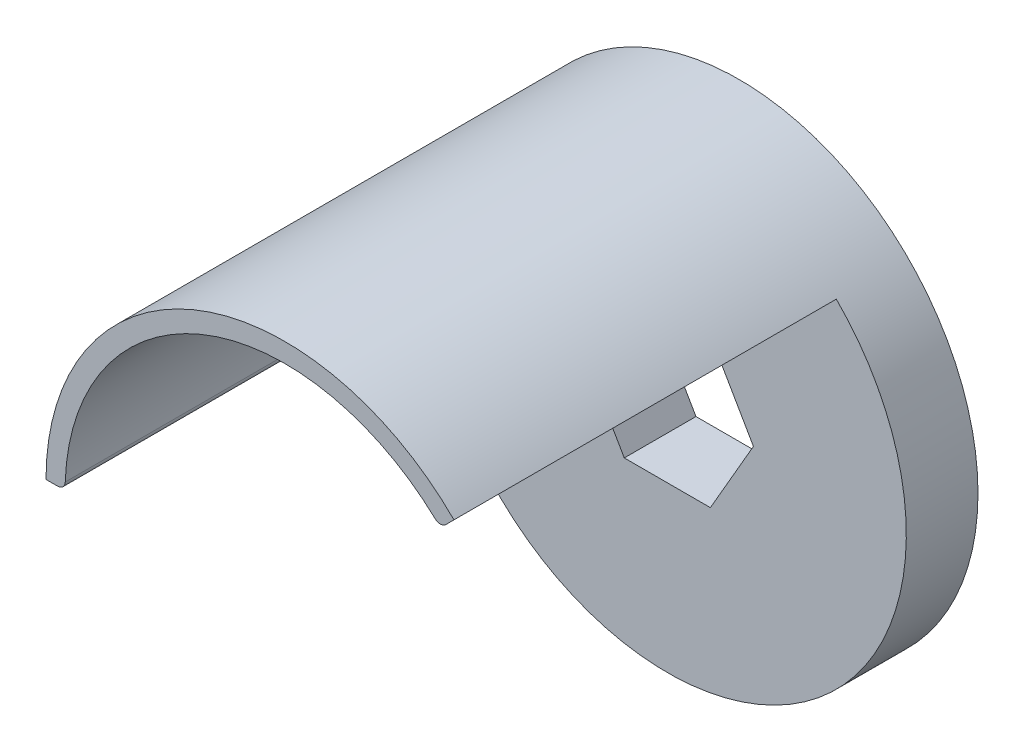
ISO-10303-21;
HEADER;
FILE_DESCRIPTION(('STEP AP214'),'2;1');
FILE_NAME('part.step','',(''),(''),'','','');
FILE_SCHEMA(('AUTOMOTIVE_DESIGN { 1 0 10303 214 1 1 1 1 }'));
ENDSEC;
DATA;
#1=APPLICATION_CONTEXT('core data for automotive mechanical design processes');
#2=APPLICATION_PROTOCOL_DEFINITION('international standard','automotive_design',2000,#1);
#3=PRODUCT_CONTEXT('',#1,'mechanical');
#4=PRODUCT('Part','Part','',(#3));
#5=PRODUCT_RELATED_PRODUCT_CATEGORY('part','',(#4));
#6=PRODUCT_DEFINITION_FORMATION('','',#4);
#7=PRODUCT_DEFINITION_CONTEXT('part definition',#1,'design');
#8=PRODUCT_DEFINITION('design','',#6,#7);
#9=PRODUCT_DEFINITION_SHAPE('','',#8);
#10=(LENGTH_UNIT() NAMED_UNIT(*) SI_UNIT(.MILLI.,.METRE.));
#11=(NAMED_UNIT(*) PLANE_ANGLE_UNIT() SI_UNIT($,.RADIAN.));
#12=(NAMED_UNIT(*) SI_UNIT($,.STERADIAN.) SOLID_ANGLE_UNIT());
#13=UNCERTAINTY_MEASURE_WITH_UNIT(LENGTH_MEASURE(1.E-05),#10,'distance_accuracy_value','');
#14=(GEOMETRIC_REPRESENTATION_CONTEXT(3) GLOBAL_UNCERTAINTY_ASSIGNED_CONTEXT((#13)) GLOBAL_UNIT_ASSIGNED_CONTEXT((#10,
#11,#12)) REPRESENTATION_CONTEXT('',''));
#15=CARTESIAN_POINT('',(0.,0.,0.));
#16=DIRECTION('',(0.,0.,1.));
#17=DIRECTION('',(1.,0.,0.));
#18=AXIS2_PLACEMENT_3D('',#15,#16,#17);
#19=CARTESIAN_POINT('',(0.,0.,4.7625));
#20=DIRECTION('',(0.,0.,1.));
#21=DIRECTION('',(1.,0.,0.));
#22=AXIS2_PLACEMENT_3D('',#19,#20,#21);
#23=PLANE('',#22);
#24=DIRECTION('',(-0.5,0.866025403784438,0.));
#25=VECTOR('',#24,1.);
#26=CARTESIAN_POINT('',(5.71923176659244,0.,4.7625));
#27=LINE('',#26,#25);
#28=CARTESIAN_POINT('',(5.71923176659244,0.,4.7625));
#29=VERTEX_POINT('',#28);
#30=CARTESIAN_POINT('',(2.85961588329621,4.953,4.7625));
#31=VERTEX_POINT('',#30);
#32=EDGE_CURVE('E182',#29,#31,#27,.T.);
#33=ORIENTED_EDGE('',*,*,#32,.F.);
#34=DIRECTION('',(0.5,0.866025403784439,0.));
#35=VECTOR('',#34,1.);
#36=CARTESIAN_POINT('',(2.85961588329622,-4.953,4.7625));
#37=LINE('',#36,#35);
#38=CARTESIAN_POINT('',(2.85961588329622,-4.953,4.7625));
#39=VERTEX_POINT('',#38);
#40=EDGE_CURVE('E179',#39,#29,#37,.T.);
#41=ORIENTED_EDGE('',*,*,#40,.F.);
#42=DIRECTION('',(1.,0.,0.));
#43=VECTOR('',#42,1.);
#44=CARTESIAN_POINT('',(-2.85961588329621,-4.953,4.7625));
#45=LINE('',#44,#43);
#46=CARTESIAN_POINT('',(-2.85961588329621,-4.953,4.7625));
#47=VERTEX_POINT('',#46);
#48=EDGE_CURVE('E196',#47,#39,#45,.T.);
#49=ORIENTED_EDGE('',*,*,#48,.F.);
#50=DIRECTION('',(0.5,-0.866025403784439,0.));
#51=VECTOR('',#50,1.);
#52=CARTESIAN_POINT('',(-5.71923176659243,0.,4.7625));
#53=LINE('',#52,#51);
#54=CARTESIAN_POINT('',(-5.71923176659243,0.,4.7625));
#55=VERTEX_POINT('',#54);
#56=EDGE_CURVE('E192',#55,#47,#53,.T.);
#57=ORIENTED_EDGE('',*,*,#56,.F.);
#58=DIRECTION('',(-0.5,-0.866025403784439,0.));
#59=VECTOR('',#58,1.);
#60=CARTESIAN_POINT('',(-2.85961588329622,4.953,4.7625));
#61=LINE('',#60,#59);
#62=CARTESIAN_POINT('',(-2.85961588329622,4.953,4.7625));
#63=VERTEX_POINT('',#62);
#64=EDGE_CURVE('E189',#63,#55,#61,.T.);
#65=ORIENTED_EDGE('',*,*,#64,.F.);
#66=DIRECTION('',(-1.,0.,0.));
#67=VECTOR('',#66,1.);
#68=CARTESIAN_POINT('',(2.85961588329621,4.953,4.7625));
#69=LINE('',#68,#67);
#70=EDGE_CURVE('E186',#31,#63,#69,.T.);
#71=ORIENTED_EDGE('',*,*,#70,.F.);
#72=EDGE_LOOP('',(#33,#41,#49,#57,#65,#71));
#73=FACE_BOUND('',#72,.T.);
#74=DIRECTION('',(0.707106781186551,0.707106781186544,0.));
#75=VECTOR('',#74,1.);
#76=CARTESIAN_POINT('',(0.,0.,4.7625));
#77=LINE('',#76,#75);
#78=CARTESIAN_POINT('',(10.6804659308478,10.6804659308477,4.7625));
#79=VERTEX_POINT('',#78);
#80=CARTESIAN_POINT('',(11.2253201513365,11.2253201513364,4.7625));
#81=VERTEX_POINT('',#80);
#82=EDGE_CURVE('E151',#79,#81,#77,.T.);
#83=ORIENTED_EDGE('',*,*,#82,.F.);
#84=CARTESIAN_POINT('',(10.3212556860051,11.0396761756905,4.7625));
#85=DIRECTION('',(0.,0.,1.));
#86=DIRECTION('',(1.,0.,0.));
#87=AXIS2_PLACEMENT_3D('',#84,#85,#86);
#88=CIRCLE('',#87,0.508);
#89=CARTESIAN_POINT('',(9.9743227217696,10.6685946235664,4.7625));
#90=VERTEX_POINT('',#89);
#91=EDGE_CURVE('E53',#79,#90,#88,.F.);
#92=ORIENTED_EDGE('',*,*,#91,.T.);
#93=CARTESIAN_POINT('',(0.,0.,4.7625));
#94=DIRECTION('',(0.,0.,1.));
#95=DIRECTION('',(1.,0.,0.));
#96=AXIS2_PLACEMENT_3D('',#93,#94,#95);
#97=CIRCLE('',#96,14.605);
#98=CARTESIAN_POINT('',(-14.5967468383605,0.490924369747899,4.7625));
#99=VERTEX_POINT('',#98);
#100=EDGE_CURVE('E169',#90,#99,#97,.T.);
#101=ORIENTED_EDGE('',*,*,#100,.T.);
#102=CARTESIAN_POINT('',(-15.1044597718687,0.508,4.7625));
#103=DIRECTION('',(0.,0.,1.));
#104=DIRECTION('',(1.,0.,0.));
#105=AXIS2_PLACEMENT_3D('',#102,#103,#104);
#106=CIRCLE('',#105,0.508);
#107=CARTESIAN_POINT('',(-15.1044597718687,0.,4.7625));
#108=VERTEX_POINT('',#107);
#109=EDGE_CURVE('E11',#99,#108,#106,.F.);
#110=ORIENTED_EDGE('',*,*,#109,.T.);
#111=DIRECTION('',(-1.,0.,0.));
#112=VECTOR('',#111,1.);
#113=CARTESIAN_POINT('',(0.,0.,4.7625));
#114=LINE('',#113,#112);
#115=CARTESIAN_POINT('',(-15.875,0.,4.7625));
#116=VERTEX_POINT('',#115);
#117=EDGE_CURVE('E174',#108,#116,#114,.T.);
#118=ORIENTED_EDGE('',*,*,#117,.T.);
#119=CARTESIAN_POINT('',(0.,0.,4.7625));
#120=DIRECTION('',(0.,0.,1.));
#121=DIRECTION('',(1.,0.,0.));
#122=AXIS2_PLACEMENT_3D('',#119,#120,#121);
#123=CIRCLE('',#122,15.875);
#124=EDGE_CURVE('E242',#116,#81,#123,.T.);
#125=ORIENTED_EDGE('',*,*,#124,.T.);
#126=EDGE_LOOP('',(#83,#92,#101,#110,#118,#125));
#127=FACE_BOUND('',#126,.T.);
#128=ADVANCED_FACE('F44',(#73,#127),#23,.T.);
#129=CARTESIAN_POINT('',(0.,0.,0.));
#130=DIRECTION('',(0.,0.,1.));
#131=DIRECTION('',(1.,0.,0.));
#132=AXIS2_PLACEMENT_3D('',#129,#130,#131);
#133=PLANE('',#132);
#134=CARTESIAN_POINT('',(0.,0.,0.));
#135=DIRECTION('',(0.,0.,1.));
#136=DIRECTION('',(1.,0.,0.));
#137=AXIS2_PLACEMENT_3D('',#134,#135,#136);
#138=CIRCLE('',#137,15.875);
#139=CARTESIAN_POINT('',(15.875,0.,0.));
#140=VERTEX_POINT('',#139);
#141=EDGE_CURVE('E241',#140,#140,#138,.T.);
#142=ORIENTED_EDGE('',*,*,#141,.F.);
#143=EDGE_LOOP('',(#142));
#144=FACE_BOUND('',#143,.T.);
#145=DIRECTION('',(0.5,0.866025403784439,0.));
#146=VECTOR('',#145,1.);
#147=CARTESIAN_POINT('',(2.85961588329622,-4.953,0.));
#148=LINE('',#147,#146);
#149=CARTESIAN_POINT('',(2.85961588329622,-4.953,0.));
#150=VERTEX_POINT('',#149);
#151=CARTESIAN_POINT('',(5.71923176659244,0.,0.));
#152=VERTEX_POINT('',#151);
#153=EDGE_CURVE('E156',#150,#152,#148,.T.);
#154=ORIENTED_EDGE('',*,*,#153,.T.);
#155=DIRECTION('',(-0.5,0.866025403784438,0.));
#156=VECTOR('',#155,1.);
#157=CARTESIAN_POINT('',(5.71923176659244,0.,0.));
#158=LINE('',#157,#156);
#159=CARTESIAN_POINT('',(2.85961588329621,4.953,0.));
#160=VERTEX_POINT('',#159);
#161=EDGE_CURVE('E203',#152,#160,#158,.T.);
#162=ORIENTED_EDGE('',*,*,#161,.T.);
#163=DIRECTION('',(-1.,0.,0.));
#164=VECTOR('',#163,1.);
#165=CARTESIAN_POINT('',(2.85961588329621,4.953,0.));
#166=LINE('',#165,#164);
#167=CARTESIAN_POINT('',(-2.85961588329622,4.953,0.));
#168=VERTEX_POINT('',#167);
#169=EDGE_CURVE('E207',#160,#168,#166,.T.);
#170=ORIENTED_EDGE('',*,*,#169,.T.);
#171=DIRECTION('',(-0.5,-0.866025403784439,0.));
#172=VECTOR('',#171,1.);
#173=CARTESIAN_POINT('',(-2.85961588329622,4.953,0.));
#174=LINE('',#173,#172);
#175=CARTESIAN_POINT('',(-5.71923176659243,0.,0.));
#176=VERTEX_POINT('',#175);
#177=EDGE_CURVE('E211',#168,#176,#174,.T.);
#178=ORIENTED_EDGE('',*,*,#177,.T.);
#179=DIRECTION('',(0.5,-0.866025403784439,0.));
#180=VECTOR('',#179,1.);
#181=CARTESIAN_POINT('',(-5.71923176659243,0.,0.));
#182=LINE('',#181,#180);
#183=CARTESIAN_POINT('',(-2.85961588329621,-4.953,0.));
#184=VERTEX_POINT('',#183);
#185=EDGE_CURVE('E215',#176,#184,#182,.T.);
#186=ORIENTED_EDGE('',*,*,#185,.T.);
#187=DIRECTION('',(1.,0.,0.));
#188=VECTOR('',#187,1.);
#189=CARTESIAN_POINT('',(-2.85961588329621,-4.953,0.));
#190=LINE('',#189,#188);
#191=EDGE_CURVE('E183',#184,#150,#190,.T.);
#192=ORIENTED_EDGE('',*,*,#191,.T.);
#193=EDGE_LOOP('',(#154,#162,#170,#178,#186,#192));
#194=FACE_BOUND('',#193,.T.);
#195=ADVANCED_FACE('F283',(#144,#194),#133,.F.);
#196=CARTESIAN_POINT('',(0.,0.,4.7625));
#197=DIRECTION('',(0.,0.,-1.));
#198=DIRECTION('',(-1.,0.,0.));
#199=AXIS2_PLACEMENT_3D('',#196,#197,#198);
#200=CYLINDRICAL_SURFACE('',#199,15.875);
#201=ORIENTED_EDGE('',*,*,#124,.F.);
#202=DIRECTION('',(0.,0.,-1.));
#203=VECTOR('',#202,1.);
#204=CARTESIAN_POINT('',(-15.875,0.,30.1625));
#205=LINE('',#204,#203);
#206=CARTESIAN_POINT('',(-15.875,0.,30.1625));
#207=VERTEX_POINT('',#206);
#208=EDGE_CURVE('E157',#207,#116,#205,.T.);
#209=ORIENTED_EDGE('',*,*,#208,.F.);
#210=CARTESIAN_POINT('',(0.,0.,30.1625));
#211=DIRECTION('',(0.,0.,1.));
#212=DIRECTION('',(1.,0.,0.));
#213=AXIS2_PLACEMENT_3D('',#210,#211,#212);
#214=CIRCLE('',#213,15.875);
#215=CARTESIAN_POINT('',(11.2253201513365,11.2253201513364,30.1625));
#216=VERTEX_POINT('',#215);
#217=EDGE_CURVE('E137',#216,#207,#214,.T.);
#218=ORIENTED_EDGE('',*,*,#217,.F.);
#219=DIRECTION('',(0.,0.,-1.));
#220=VECTOR('',#219,1.);
#221=CARTESIAN_POINT('',(11.2253201513365,11.2253201513364,30.1625));
#222=LINE('',#221,#220);
#223=EDGE_CURVE('E148',#216,#81,#222,.T.);
#224=ORIENTED_EDGE('',*,*,#223,.T.);
#225=EDGE_LOOP('',(#201,#209,#218,#224));
#226=FACE_BOUND('',#225,.T.);
#227=ORIENTED_EDGE('',*,*,#141,.T.);
#228=EDGE_LOOP('',(#227));
#229=FACE_BOUND('',#228,.T.);
#230=ADVANCED_FACE('F159',(#226,#229),#200,.T.);
#231=CARTESIAN_POINT('',(2.85961588329622,-4.953,4.7625));
#232=DIRECTION('',(-0.866025403784439,0.5,0.));
#233=DIRECTION('',(-0.5,-0.866025403784438,0.));
#234=AXIS2_PLACEMENT_3D('',#231,#232,#233);
#235=PLANE('',#234);
#236=ORIENTED_EDGE('',*,*,#153,.F.);
#237=DIRECTION('',(0.,0.,-1.));
#238=VECTOR('',#237,1.);
#239=CARTESIAN_POINT('',(2.85961588329622,-4.953,4.7625));
#240=LINE('',#239,#238);
#241=EDGE_CURVE('E199',#39,#150,#240,.T.);
#242=ORIENTED_EDGE('',*,*,#241,.F.);
#243=ORIENTED_EDGE('',*,*,#40,.T.);
#244=DIRECTION('',(0.,0.,-1.));
#245=VECTOR('',#244,1.);
#246=CARTESIAN_POINT('',(5.71923176659244,0.,4.7625));
#247=LINE('',#246,#245);
#248=EDGE_CURVE('E237',#29,#152,#247,.T.);
#249=ORIENTED_EDGE('',*,*,#248,.T.);
#250=EDGE_LOOP('',(#236,#242,#243,#249));
#251=FACE_BOUND('',#250,.T.);
#252=ADVANCED_FACE('F293',(#251),#235,.T.);
#253=CARTESIAN_POINT('',(5.71923176659244,0.,4.7625));
#254=DIRECTION('',(-0.866025403784439,-0.5,0.));
#255=DIRECTION('',(0.5,-0.866025403784438,0.));
#256=AXIS2_PLACEMENT_3D('',#253,#254,#255);
#257=PLANE('',#256);
#258=ORIENTED_EDGE('',*,*,#161,.F.);
#259=ORIENTED_EDGE('',*,*,#248,.F.);
#260=ORIENTED_EDGE('',*,*,#32,.T.);
#261=DIRECTION('',(0.,0.,-1.));
#262=VECTOR('',#261,1.);
#263=CARTESIAN_POINT('',(2.85961588329621,4.953,4.7625));
#264=LINE('',#263,#262);
#265=EDGE_CURVE('E234',#31,#160,#264,.T.);
#266=ORIENTED_EDGE('',*,*,#265,.T.);
#267=EDGE_LOOP('',(#258,#259,#260,#266));
#268=FACE_BOUND('',#267,.T.);
#269=ADVANCED_FACE('F299',(#268),#257,.T.);
#270=CARTESIAN_POINT('',(2.85961588329621,4.953,4.7625));
#271=DIRECTION('',(0.,-1.,0.));
#272=DIRECTION('',(0.,0.,-1.));
#273=AXIS2_PLACEMENT_3D('',#270,#271,#272);
#274=PLANE('',#273);
#275=ORIENTED_EDGE('',*,*,#169,.F.);
#276=ORIENTED_EDGE('',*,*,#265,.F.);
#277=ORIENTED_EDGE('',*,*,#70,.T.);
#278=DIRECTION('',(0.,0.,-1.));
#279=VECTOR('',#278,1.);
#280=CARTESIAN_POINT('',(-2.85961588329622,4.953,4.7625));
#281=LINE('',#280,#279);
#282=EDGE_CURVE('E231',#63,#168,#281,.T.);
#283=ORIENTED_EDGE('',*,*,#282,.T.);
#284=EDGE_LOOP('',(#275,#276,#277,#283));
#285=FACE_BOUND('',#284,.T.);
#286=ADVANCED_FACE('F304',(#285),#274,.T.);
#287=CARTESIAN_POINT('',(-2.85961588329622,4.953,4.7625));
#288=DIRECTION('',(0.866025403784439,-0.5,0.));
#289=DIRECTION('',(0.5,0.866025403784439,0.));
#290=AXIS2_PLACEMENT_3D('',#287,#288,#289);
#291=PLANE('',#290);
#292=ORIENTED_EDGE('',*,*,#177,.F.);
#293=ORIENTED_EDGE('',*,*,#282,.F.);
#294=ORIENTED_EDGE('',*,*,#64,.T.);
#295=DIRECTION('',(0.,0.,-1.));
#296=VECTOR('',#295,1.);
#297=CARTESIAN_POINT('',(-5.71923176659243,0.,4.7625));
#298=LINE('',#297,#296);
#299=EDGE_CURVE('E228',#55,#176,#298,.T.);
#300=ORIENTED_EDGE('',*,*,#299,.T.);
#301=EDGE_LOOP('',(#292,#293,#294,#300));
#302=FACE_BOUND('',#301,.T.);
#303=ADVANCED_FACE('F327',(#302),#291,.T.);
#304=CARTESIAN_POINT('',(-5.71923176659243,0.,4.7625));
#305=DIRECTION('',(0.866025403784439,0.5,0.));
#306=DIRECTION('',(-0.5,0.866025403784438,0.));
#307=AXIS2_PLACEMENT_3D('',#304,#305,#306);
#308=PLANE('',#307);
#309=ORIENTED_EDGE('',*,*,#185,.F.);
#310=ORIENTED_EDGE('',*,*,#299,.F.);
#311=ORIENTED_EDGE('',*,*,#56,.T.);
#312=DIRECTION('',(0.,0.,-1.));
#313=VECTOR('',#312,1.);
#314=CARTESIAN_POINT('',(-2.85961588329621,-4.953,4.7625));
#315=LINE('',#314,#313);
#316=EDGE_CURVE('E225',#47,#184,#315,.T.);
#317=ORIENTED_EDGE('',*,*,#316,.T.);
#318=EDGE_LOOP('',(#309,#310,#311,#317));
#319=FACE_BOUND('',#318,.T.);
#320=ADVANCED_FACE('F318',(#319),#308,.T.);
#321=CARTESIAN_POINT('',(-2.85961588329621,-4.953,4.7625));
#322=DIRECTION('',(0.,1.,0.));
#323=DIRECTION('',(-1.,0.,0.));
#324=AXIS2_PLACEMENT_3D('',#321,#322,#323);
#325=PLANE('',#324);
#326=ORIENTED_EDGE('',*,*,#191,.F.);
#327=ORIENTED_EDGE('',*,*,#316,.F.);
#328=ORIENTED_EDGE('',*,*,#48,.T.);
#329=ORIENTED_EDGE('',*,*,#241,.T.);
#330=EDGE_LOOP('',(#326,#327,#328,#329));
#331=FACE_BOUND('',#330,.T.);
#332=ADVANCED_FACE('F312',(#331),#325,.T.);
#333=CARTESIAN_POINT('',(0.,0.,30.1625));
#334=DIRECTION('',(0.,0.,-1.));
#335=DIRECTION('',(-1.,0.,0.));
#336=AXIS2_PLACEMENT_3D('',#333,#334,#335);
#337=CYLINDRICAL_SURFACE('',#336,14.605);
#338=ORIENTED_EDGE('',*,*,#100,.F.);
#339=DIRECTION('',(0.,0.,-1.));
#340=VECTOR('',#339,1.);
#341=CARTESIAN_POINT('',(9.9743227217696,10.6685946235664,30.1625));
#342=LINE('',#341,#340);
#343=CARTESIAN_POINT('',(9.9743227217696,10.6685946235664,30.1625));
#344=VERTEX_POINT('',#343);
#345=EDGE_CURVE('E255',#90,#344,#342,.F.);
#346=ORIENTED_EDGE('',*,*,#345,.T.);
#347=CARTESIAN_POINT('',(0.,0.,30.1625));
#348=DIRECTION('',(0.,0.,1.));
#349=DIRECTION('',(1.,0.,0.));
#350=AXIS2_PLACEMENT_3D('',#347,#348,#349);
#351=CIRCLE('',#350,14.605);
#352=CARTESIAN_POINT('',(-14.5967468383605,0.490924369747899,30.1625));
#353=VERTEX_POINT('',#352);
#354=EDGE_CURVE('E145',#344,#353,#351,.T.);
#355=ORIENTED_EDGE('',*,*,#354,.T.);
#356=DIRECTION('',(0.,0.,-1.));
#357=VECTOR('',#356,1.);
#358=CARTESIAN_POINT('',(-14.5967468383605,0.490924369747899,30.1625));
#359=LINE('',#358,#357);
#360=EDGE_CURVE('E251',#353,#99,#359,.T.);
#361=ORIENTED_EDGE('',*,*,#360,.T.);
#362=EDGE_LOOP('',(#338,#346,#355,#361));
#363=FACE_BOUND('',#362,.T.);
#364=ADVANCED_FACE('F269',(#363),#337,.F.);
#365=CARTESIAN_POINT('',(0.,0.,30.1625));
#366=DIRECTION('',(-0.707106781186544,0.707106781186551,0.));
#367=DIRECTION('',(-0.707106781186551,-0.707106781186544,0.));
#368=AXIS2_PLACEMENT_3D('',#365,#366,#367);
#369=PLANE('',#368);
#370=DIRECTION('',(0.707106781186551,0.707106781186544,0.));
#371=VECTOR('',#370,1.);
#372=CARTESIAN_POINT('',(0.,0.,30.1625));
#373=LINE('',#372,#371);
#374=CARTESIAN_POINT('',(10.6804659308478,10.6804659308477,30.1625));
#375=VERTEX_POINT('',#374);
#376=EDGE_CURVE('E132',#375,#216,#373,.T.);
#377=ORIENTED_EDGE('',*,*,#376,.F.);
#378=DIRECTION('',(0.,0.,1.));
#379=VECTOR('',#378,1.);
#380=CARTESIAN_POINT('',(10.6804659308478,10.6804659308477,4.7625));
#381=LINE('',#380,#379);
#382=EDGE_CURVE('E245',#375,#79,#381,.F.);
#383=ORIENTED_EDGE('',*,*,#382,.T.);
#384=ORIENTED_EDGE('',*,*,#82,.T.);
#385=ORIENTED_EDGE('',*,*,#223,.F.);
#386=EDGE_LOOP('',(#377,#383,#384,#385));
#387=FACE_BOUND('',#386,.T.);
#388=ADVANCED_FACE('F149',(#387),#369,.F.);
#389=CARTESIAN_POINT('',(0.,0.,30.1625));
#390=DIRECTION('',(0.,-1.,0.));
#391=DIRECTION('',(1.,0.,0.));
#392=AXIS2_PLACEMENT_3D('',#389,#390,#391);
#393=PLANE('',#392);
#394=ORIENTED_EDGE('',*,*,#117,.F.);
#395=DIRECTION('',(0.,0.,-1.));
#396=VECTOR('',#395,1.);
#397=CARTESIAN_POINT('',(-15.1044597718687,0.,30.1625));
#398=LINE('',#397,#396);
#399=CARTESIAN_POINT('',(-15.1044597718687,0.,30.1625));
#400=VERTEX_POINT('',#399);
#401=EDGE_CURVE('E65',#108,#400,#398,.F.);
#402=ORIENTED_EDGE('',*,*,#401,.T.);
#403=DIRECTION('',(-1.,0.,0.));
#404=VECTOR('',#403,1.);
#405=CARTESIAN_POINT('',(0.,0.,30.1625));
#406=LINE('',#405,#404);
#407=EDGE_CURVE('E163',#400,#207,#406,.T.);
#408=ORIENTED_EDGE('',*,*,#407,.T.);
#409=ORIENTED_EDGE('',*,*,#208,.T.);
#410=EDGE_LOOP('',(#394,#402,#408,#409));
#411=FACE_BOUND('',#410,.T.);
#412=ADVANCED_FACE('F279',(#411),#393,.T.);
#413=CARTESIAN_POINT('',(0.,0.,30.1625));
#414=DIRECTION('',(0.,0.,1.));
#415=DIRECTION('',(1.,0.,0.));
#416=AXIS2_PLACEMENT_3D('',#413,#414,#415);
#417=PLANE('',#416);
#418=ORIENTED_EDGE('',*,*,#354,.F.);
#419=CARTESIAN_POINT('',(10.3212556860051,11.0396761756905,30.1625));
#420=DIRECTION('',(0.,0.,1.));
#421=DIRECTION('',(1.,0.,0.));
#422=AXIS2_PLACEMENT_3D('',#419,#420,#421);
#423=CIRCLE('',#422,0.508);
#424=EDGE_CURVE('E140',#344,#375,#423,.T.);
#425=ORIENTED_EDGE('',*,*,#424,.T.);
#426=ORIENTED_EDGE('',*,*,#376,.T.);
#427=ORIENTED_EDGE('',*,*,#217,.T.);
#428=ORIENTED_EDGE('',*,*,#407,.F.);
#429=CARTESIAN_POINT('',(-15.1044597718687,0.508,30.1625));
#430=DIRECTION('',(0.,0.,1.));
#431=DIRECTION('',(1.,0.,0.));
#432=AXIS2_PLACEMENT_3D('',#429,#430,#431);
#433=CIRCLE('',#432,0.508);
#434=EDGE_CURVE('E258',#400,#353,#433,.T.);
#435=ORIENTED_EDGE('',*,*,#434,.T.);
#436=EDGE_LOOP('',(#418,#425,#426,#427,#428,#435));
#437=FACE_BOUND('',#436,.T.);
#438=ADVANCED_FACE('F135',(#437),#417,.T.);
#439=CARTESIAN_POINT('',(10.3212556860051,11.0396761756905,30.1625));
#440=DIRECTION('',(0.,0.,-1.));
#441=DIRECTION('',(-1.,0.,0.));
#442=AXIS2_PLACEMENT_3D('',#439,#440,#441);
#443=CYLINDRICAL_SURFACE('',#442,0.508);
#444=ORIENTED_EDGE('',*,*,#424,.F.);
#445=ORIENTED_EDGE('',*,*,#345,.F.);
#446=ORIENTED_EDGE('',*,*,#91,.F.);
#447=ORIENTED_EDGE('',*,*,#382,.F.);
#448=EDGE_LOOP('',(#444,#445,#446,#447));
#449=FACE_BOUND('',#448,.T.);
#450=ADVANCED_FACE('F272',(#449),#443,.T.);
#451=CARTESIAN_POINT('',(-15.1044597718687,0.508,30.1625));
#452=DIRECTION('',(0.,0.,-1.));
#453=DIRECTION('',(-1.,0.,0.));
#454=AXIS2_PLACEMENT_3D('',#451,#452,#453);
#455=CYLINDRICAL_SURFACE('',#454,0.508);
#456=ORIENTED_EDGE('',*,*,#434,.F.);
#457=ORIENTED_EDGE('',*,*,#401,.F.);
#458=ORIENTED_EDGE('',*,*,#109,.F.);
#459=ORIENTED_EDGE('',*,*,#360,.F.);
#460=EDGE_LOOP('',(#456,#457,#458,#459));
#461=FACE_BOUND('',#460,.T.);
#462=ADVANCED_FACE('F46',(#461),#455,.T.);
#463=CLOSED_SHELL('',(#128,#195,#230,#252,#269,#286,#303,#320,#332,#364,#388,#412,#438,#450,#462));
#464=MANIFOLD_SOLID_BREP('B2',#463);
#465=ADVANCED_BREP_SHAPE_REPRESENTATION('',(#18,#464),#14);
#466=SHAPE_DEFINITION_REPRESENTATION(#9,#465);
ENDSEC;
END-ISO-10303-21;
